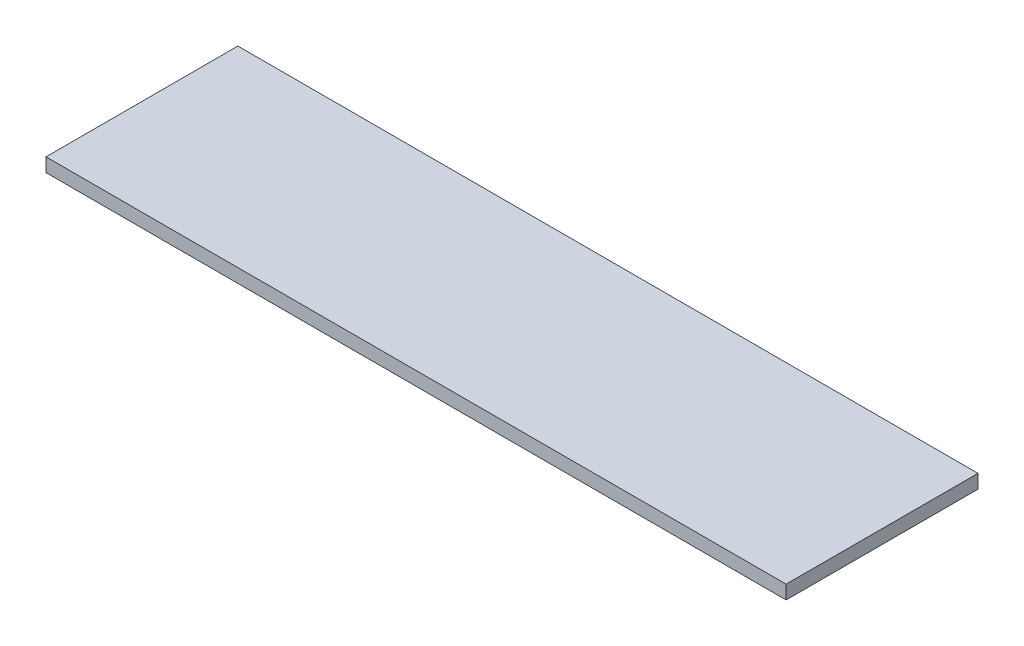
ISO-10303-21;
HEADER;
FILE_DESCRIPTION(('STEP AP214'),'2;1');
FILE_NAME('part.step','',(''),(''),'','','');
FILE_SCHEMA(('AUTOMOTIVE_DESIGN { 1 0 10303 214 1 1 1 1 }'));
ENDSEC;
DATA;
#1=APPLICATION_CONTEXT('core data for automotive mechanical design processes');
#2=APPLICATION_PROTOCOL_DEFINITION('international standard','automotive_design',2000,#1);
#3=PRODUCT_CONTEXT('',#1,'mechanical');
#4=PRODUCT('Part','Part','',(#3));
#5=PRODUCT_RELATED_PRODUCT_CATEGORY('part','',(#4));
#6=PRODUCT_DEFINITION_FORMATION('','',#4);
#7=PRODUCT_DEFINITION_CONTEXT('part definition',#1,'design');
#8=PRODUCT_DEFINITION('design','',#6,#7);
#9=PRODUCT_DEFINITION_SHAPE('','',#8);
#10=(LENGTH_UNIT() NAMED_UNIT(*) SI_UNIT(.MILLI.,.METRE.));
#11=(NAMED_UNIT(*) PLANE_ANGLE_UNIT() SI_UNIT($,.RADIAN.));
#12=(NAMED_UNIT(*) SI_UNIT($,.STERADIAN.) SOLID_ANGLE_UNIT());
#13=UNCERTAINTY_MEASURE_WITH_UNIT(LENGTH_MEASURE(1.E-05),#10,'distance_accuracy_value','');
#14=(GEOMETRIC_REPRESENTATION_CONTEXT(3) GLOBAL_UNCERTAINTY_ASSIGNED_CONTEXT((#13)) GLOBAL_UNIT_ASSIGNED_CONTEXT((#10,
#11,#12)) REPRESENTATION_CONTEXT('',''));
#15=CARTESIAN_POINT('',(0.,0.,0.));
#16=DIRECTION('',(0.,0.,1.));
#17=DIRECTION('',(1.,0.,0.));
#18=AXIS2_PLACEMENT_3D('',#15,#16,#17);
#19=CARTESIAN_POINT('',(81.,3.,-21.));
#20=DIRECTION('',(-1.,0.,0.));
#21=DIRECTION('',(0.,0.,1.));
#22=AXIS2_PLACEMENT_3D('',#19,#20,#21);
#23=PLANE('',#22);
#24=DIRECTION('',(0.,0.,-1.));
#25=VECTOR('',#24,1.);
#26=CARTESIAN_POINT('',(81.,0.,-21.));
#27=LINE('',#26,#25);
#28=CARTESIAN_POINT('',(81.,0.,21.));
#29=VERTEX_POINT('',#28);
#30=CARTESIAN_POINT('',(81.,0.,-21.));
#31=VERTEX_POINT('',#30);
#32=EDGE_CURVE('E107',#29,#31,#27,.T.);
#33=ORIENTED_EDGE('',*,*,#32,.T.);
#34=DIRECTION('',(0.,-1.,0.));
#35=VECTOR('',#34,1.);
#36=CARTESIAN_POINT('',(81.,3.,-21.));
#37=LINE('',#36,#35);
#38=CARTESIAN_POINT('',(81.,3.,-21.));
#39=VERTEX_POINT('',#38);
#40=EDGE_CURVE('E11',#39,#31,#37,.T.);
#41=ORIENTED_EDGE('',*,*,#40,.F.);
#42=DIRECTION('',(0.,0.,-1.));
#43=VECTOR('',#42,1.);
#44=CARTESIAN_POINT('',(81.,3.,-21.));
#45=LINE('',#44,#43);
#46=CARTESIAN_POINT('',(81.,3.,21.));
#47=VERTEX_POINT('',#46);
#48=EDGE_CURVE('E91',#47,#39,#45,.T.);
#49=ORIENTED_EDGE('',*,*,#48,.F.);
#50=DIRECTION('',(0.,-1.,0.));
#51=VECTOR('',#50,1.);
#52=CARTESIAN_POINT('',(81.,3.,21.));
#53=LINE('',#52,#51);
#54=EDGE_CURVE('E103',#47,#29,#53,.T.);
#55=ORIENTED_EDGE('',*,*,#54,.T.);
#56=EDGE_LOOP('',(#33,#41,#49,#55));
#57=FACE_BOUND('',#56,.T.);
#58=ADVANCED_FACE('F39',(#57),#23,.F.);
#59=CARTESIAN_POINT('',(-81.,3.,-21.));
#60=DIRECTION('',(0.,0.,1.));
#61=DIRECTION('',(1.,0.,0.));
#62=AXIS2_PLACEMENT_3D('',#59,#60,#61);
#63=PLANE('',#62);
#64=DIRECTION('',(-1.,0.,0.));
#65=VECTOR('',#64,1.);
#66=CARTESIAN_POINT('',(-81.,0.,-21.));
#67=LINE('',#66,#65);
#68=CARTESIAN_POINT('',(-81.,0.,-21.));
#69=VERTEX_POINT('',#68);
#70=EDGE_CURVE('E96',#31,#69,#67,.T.);
#71=ORIENTED_EDGE('',*,*,#70,.T.);
#72=DIRECTION('',(0.,-1.,0.));
#73=VECTOR('',#72,1.);
#74=CARTESIAN_POINT('',(-81.,3.,-21.));
#75=LINE('',#74,#73);
#76=CARTESIAN_POINT('',(-81.,3.,-21.));
#77=VERTEX_POINT('',#76);
#78=EDGE_CURVE('E48',#77,#69,#75,.T.);
#79=ORIENTED_EDGE('',*,*,#78,.F.);
#80=DIRECTION('',(-1.,0.,0.));
#81=VECTOR('',#80,1.);
#82=CARTESIAN_POINT('',(-81.,3.,-21.));
#83=LINE('',#82,#81);
#84=EDGE_CURVE('E86',#39,#77,#83,.T.);
#85=ORIENTED_EDGE('',*,*,#84,.F.);
#86=ORIENTED_EDGE('',*,*,#40,.T.);
#87=EDGE_LOOP('',(#71,#79,#85,#86));
#88=FACE_BOUND('',#87,.T.);
#89=ADVANCED_FACE('F95',(#88),#63,.F.);
#90=CARTESIAN_POINT('',(-81.,3.,-21.));
#91=DIRECTION('',(1.,0.,0.));
#92=DIRECTION('',(0.,0.,-1.));
#93=AXIS2_PLACEMENT_3D('',#90,#91,#92);
#94=PLANE('',#93);
#95=DIRECTION('',(0.,0.,1.));
#96=VECTOR('',#95,1.);
#97=CARTESIAN_POINT('',(-81.,0.,-21.));
#98=LINE('',#97,#96);
#99=CARTESIAN_POINT('',(-81.,0.,21.));
#100=VERTEX_POINT('',#99);
#101=EDGE_CURVE('E73',#69,#100,#98,.T.);
#102=ORIENTED_EDGE('',*,*,#101,.T.);
#103=DIRECTION('',(0.,-1.,0.));
#104=VECTOR('',#103,1.);
#105=CARTESIAN_POINT('',(-81.,3.,21.));
#106=LINE('',#105,#104);
#107=CARTESIAN_POINT('',(-81.,3.,21.));
#108=VERTEX_POINT('',#107);
#109=EDGE_CURVE('E98',#108,#100,#106,.T.);
#110=ORIENTED_EDGE('',*,*,#109,.F.);
#111=DIRECTION('',(0.,0.,1.));
#112=VECTOR('',#111,1.);
#113=CARTESIAN_POINT('',(-81.,3.,-21.));
#114=LINE('',#113,#112);
#115=EDGE_CURVE('E89',#77,#108,#114,.T.);
#116=ORIENTED_EDGE('',*,*,#115,.F.);
#117=ORIENTED_EDGE('',*,*,#78,.T.);
#118=EDGE_LOOP('',(#102,#110,#116,#117));
#119=FACE_BOUND('',#118,.T.);
#120=ADVANCED_FACE('F99',(#119),#94,.F.);
#121=CARTESIAN_POINT('',(-81.,3.,21.));
#122=DIRECTION('',(0.,0.,-1.));
#123=DIRECTION('',(-1.,0.,0.));
#124=AXIS2_PLACEMENT_3D('',#121,#122,#123);
#125=PLANE('',#124);
#126=DIRECTION('',(1.,0.,0.));
#127=VECTOR('',#126,1.);
#128=CARTESIAN_POINT('',(-81.,0.,21.));
#129=LINE('',#128,#127);
#130=EDGE_CURVE('E79',#100,#29,#129,.T.);
#131=ORIENTED_EDGE('',*,*,#130,.T.);
#132=ORIENTED_EDGE('',*,*,#54,.F.);
#133=DIRECTION('',(1.,0.,0.));
#134=VECTOR('',#133,1.);
#135=CARTESIAN_POINT('',(-81.,3.,21.));
#136=LINE('',#135,#134);
#137=EDGE_CURVE('E56',#108,#47,#136,.T.);
#138=ORIENTED_EDGE('',*,*,#137,.F.);
#139=ORIENTED_EDGE('',*,*,#109,.T.);
#140=EDGE_LOOP('',(#131,#132,#138,#139));
#141=FACE_BOUND('',#140,.T.);
#142=ADVANCED_FACE('F120',(#141),#125,.F.);
#143=CARTESIAN_POINT('',(0.,3.,0.));
#144=DIRECTION('',(0.,1.,0.));
#145=DIRECTION('',(0.,0.,1.));
#146=AXIS2_PLACEMENT_3D('',#143,#144,#145);
#147=PLANE('',#146);
#148=ORIENTED_EDGE('',*,*,#48,.T.);
#149=ORIENTED_EDGE('',*,*,#84,.T.);
#150=ORIENTED_EDGE('',*,*,#115,.T.);
#151=ORIENTED_EDGE('',*,*,#137,.T.);
#152=EDGE_LOOP('',(#148,#149,#150,#151));
#153=FACE_BOUND('',#152,.T.);
#154=ADVANCED_FACE('F87',(#153),#147,.T.);
#155=CARTESIAN_POINT('',(0.,0.,0.));
#156=DIRECTION('',(0.,1.,0.));
#157=DIRECTION('',(0.,0.,1.));
#158=AXIS2_PLACEMENT_3D('',#155,#156,#157);
#159=PLANE('',#158);
#160=ORIENTED_EDGE('',*,*,#32,.F.);
#161=ORIENTED_EDGE('',*,*,#130,.F.);
#162=ORIENTED_EDGE('',*,*,#101,.F.);
#163=ORIENTED_EDGE('',*,*,#70,.F.);
#164=EDGE_LOOP('',(#160,#161,#162,#163));
#165=FACE_BOUND('',#164,.T.);
#166=ADVANCED_FACE('F123',(#165),#159,.F.);
#167=CLOSED_SHELL('',(#58,#89,#120,#142,#154,#166));
#168=MANIFOLD_SOLID_BREP('B2',#167);
#169=ADVANCED_BREP_SHAPE_REPRESENTATION('',(#18,#168),#14);
#170=SHAPE_DEFINITION_REPRESENTATION(#9,#169);
ENDSEC;
END-ISO-10303-21;
